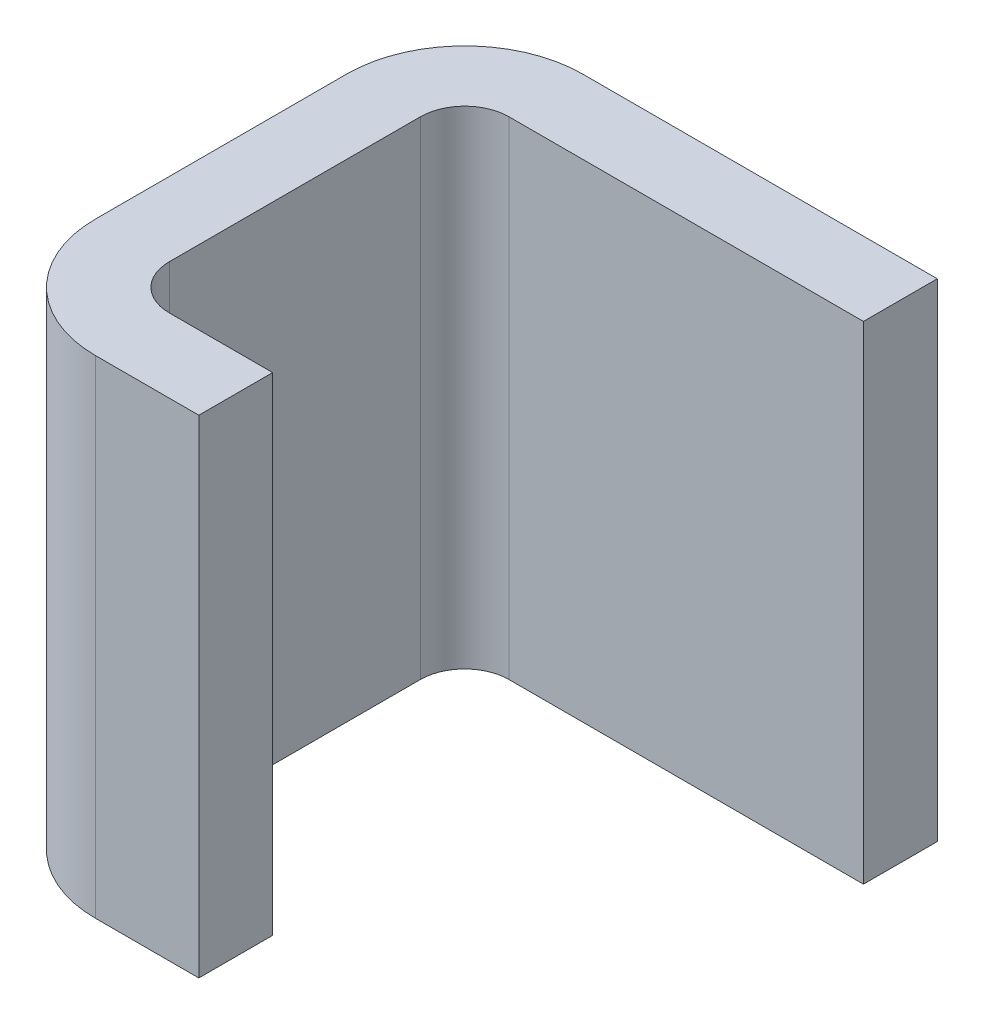
ISO-10303-21;
HEADER;
FILE_DESCRIPTION(('STEP AP214'),'2;1');
FILE_NAME('part.step','',(''),(''),'','','');
FILE_SCHEMA(('AUTOMOTIVE_DESIGN { 1 0 10303 214 1 1 1 1 }'));
ENDSEC;
DATA;
#1=APPLICATION_CONTEXT('core data for automotive mechanical design processes');
#2=APPLICATION_PROTOCOL_DEFINITION('international standard','automotive_design',2000,#1);
#3=PRODUCT_CONTEXT('',#1,'mechanical');
#4=PRODUCT('Part','Part','',(#3));
#5=PRODUCT_RELATED_PRODUCT_CATEGORY('part','',(#4));
#6=PRODUCT_DEFINITION_FORMATION('','',#4);
#7=PRODUCT_DEFINITION_CONTEXT('part definition',#1,'design');
#8=PRODUCT_DEFINITION('design','',#6,#7);
#9=PRODUCT_DEFINITION_SHAPE('','',#8);
#10=(LENGTH_UNIT() NAMED_UNIT(*) SI_UNIT(.MILLI.,.METRE.));
#11=(NAMED_UNIT(*) PLANE_ANGLE_UNIT() SI_UNIT($,.RADIAN.));
#12=(NAMED_UNIT(*) SI_UNIT($,.STERADIAN.) SOLID_ANGLE_UNIT());
#13=UNCERTAINTY_MEASURE_WITH_UNIT(LENGTH_MEASURE(1.E-05),#10,'distance_accuracy_value','');
#14=(GEOMETRIC_REPRESENTATION_CONTEXT(3) GLOBAL_UNCERTAINTY_ASSIGNED_CONTEXT((#13)) GLOBAL_UNIT_ASSIGNED_CONTEXT((#10,
#11,#12)) REPRESENTATION_CONTEXT('',''));
#15=CARTESIAN_POINT('',(0.,0.,0.));
#16=DIRECTION('',(0.,0.,1.));
#17=DIRECTION('',(1.,0.,0.));
#18=AXIS2_PLACEMENT_3D('',#15,#16,#17);
#19=CARTESIAN_POINT('',(0.800000000000002,-0.825,0.));
#20=DIRECTION('',(0.,0.,-1.));
#21=DIRECTION('',(-1.,0.,0.));
#22=AXIS2_PLACEMENT_3D('',#19,#20,#21);
#23=PLANE('',#22);
#24=DIRECTION('',(-1.,0.,0.));
#25=VECTOR('',#24,1.);
#26=CARTESIAN_POINT('',(0.800000000000002,-0.825,0.));
#27=LINE('',#26,#25);
#28=CARTESIAN_POINT('',(0.800000000000002,-0.825,0.));
#29=VERTEX_POINT('',#28);
#30=CARTESIAN_POINT('',(-0.399999999999998,-0.825,0.));
#31=VERTEX_POINT('',#30);
#32=EDGE_CURVE('E11',#29,#31,#27,.T.);
#33=ORIENTED_EDGE('',*,*,#32,.T.);
#34=DIRECTION('',(0.,1.,0.));
#35=VECTOR('',#34,1.);
#36=CARTESIAN_POINT('',(-0.399999999999998,-0.825,0.));
#37=LINE('',#36,#35);
#38=CARTESIAN_POINT('',(-0.399999999999998,0.825,0.));
#39=VERTEX_POINT('',#38);
#40=EDGE_CURVE('E24',#31,#39,#37,.T.);
#41=ORIENTED_EDGE('',*,*,#40,.T.);
#42=DIRECTION('',(-1.,0.,0.));
#43=VECTOR('',#42,1.);
#44=CARTESIAN_POINT('',(0.800000000000002,0.825,0.));
#45=LINE('',#44,#43);
#46=CARTESIAN_POINT('',(0.800000000000002,0.825,0.));
#47=VERTEX_POINT('',#46);
#48=EDGE_CURVE('E193',#47,#39,#45,.T.);
#49=ORIENTED_EDGE('',*,*,#48,.F.);
#50=DIRECTION('',(0.,1.,0.));
#51=VECTOR('',#50,1.);
#52=CARTESIAN_POINT('',(0.800000000000002,-0.825,0.));
#53=LINE('',#52,#51);
#54=EDGE_CURVE('E125',#29,#47,#53,.T.);
#55=ORIENTED_EDGE('',*,*,#54,.F.);
#56=EDGE_LOOP('',(#33,#41,#49,#55));
#57=FACE_BOUND('',#56,.T.);
#58=ADVANCED_FACE('F17',(#57),#23,.T.);
#59=CARTESIAN_POINT('',(-0.399999999999998,-0.825,0.4));
#60=DIRECTION('',(0.,1.,0.));
#61=DIRECTION('',(0.,0.,-1.));
#62=AXIS2_PLACEMENT_3D('',#59,#60,#61);
#63=CYLINDRICAL_SURFACE('',#62,0.4);
#64=CARTESIAN_POINT('',(-0.399999999999998,-0.825,0.4));
#65=DIRECTION('',(0.,1.,0.));
#66=DIRECTION('',(0.,0.,-1.));
#67=AXIS2_PLACEMENT_3D('',#64,#65,#66);
#68=CIRCLE('',#67,0.4);
#69=CARTESIAN_POINT('',(-0.8,-0.825,0.4));
#70=VERTEX_POINT('',#69);
#71=EDGE_CURVE('E190',#31,#70,#68,.T.);
#72=ORIENTED_EDGE('',*,*,#71,.T.);
#73=DIRECTION('',(0.,1.,0.));
#74=VECTOR('',#73,1.);
#75=CARTESIAN_POINT('',(-0.8,-0.825,0.4));
#76=LINE('',#75,#74);
#77=CARTESIAN_POINT('',(-0.8,0.825,0.4));
#78=VERTEX_POINT('',#77);
#79=EDGE_CURVE('E188',#70,#78,#76,.T.);
#80=ORIENTED_EDGE('',*,*,#79,.T.);
#81=CARTESIAN_POINT('',(-0.399999999999998,0.825,0.4));
#82=DIRECTION('',(0.,1.,0.));
#83=DIRECTION('',(0.,0.,-1.));
#84=AXIS2_PLACEMENT_3D('',#81,#82,#83);
#85=CIRCLE('',#84,0.4);
#86=EDGE_CURVE('E185',#39,#78,#85,.T.);
#87=ORIENTED_EDGE('',*,*,#86,.F.);
#88=ORIENTED_EDGE('',*,*,#40,.F.);
#89=EDGE_LOOP('',(#72,#80,#87,#88));
#90=FACE_BOUND('',#89,.T.);
#91=ADVANCED_FACE('F197',(#90),#63,.T.);
#92=CARTESIAN_POINT('',(-0.8,-0.825,0.4));
#93=DIRECTION('',(-1.,0.,0.));
#94=DIRECTION('',(0.,0.,1.));
#95=AXIS2_PLACEMENT_3D('',#92,#93,#94);
#96=PLANE('',#95);
#97=DIRECTION('',(0.,0.,1.));
#98=VECTOR('',#97,1.);
#99=CARTESIAN_POINT('',(-0.8,-0.825,0.4));
#100=LINE('',#99,#98);
#101=CARTESIAN_POINT('',(-0.8,-0.825,1.25));
#102=VERTEX_POINT('',#101);
#103=EDGE_CURVE('E183',#70,#102,#100,.T.);
#104=ORIENTED_EDGE('',*,*,#103,.T.);
#105=DIRECTION('',(0.,1.,0.));
#106=VECTOR('',#105,1.);
#107=CARTESIAN_POINT('',(-0.8,-0.825,1.25));
#108=LINE('',#107,#106);
#109=CARTESIAN_POINT('',(-0.8,0.825,1.25));
#110=VERTEX_POINT('',#109);
#111=EDGE_CURVE('E181',#102,#110,#108,.T.);
#112=ORIENTED_EDGE('',*,*,#111,.T.);
#113=DIRECTION('',(0.,0.,1.));
#114=VECTOR('',#113,1.);
#115=CARTESIAN_POINT('',(-0.8,0.825,0.4));
#116=LINE('',#115,#114);
#117=EDGE_CURVE('E178',#78,#110,#116,.T.);
#118=ORIENTED_EDGE('',*,*,#117,.F.);
#119=ORIENTED_EDGE('',*,*,#79,.F.);
#120=EDGE_LOOP('',(#104,#112,#118,#119));
#121=FACE_BOUND('',#120,.T.);
#122=ADVANCED_FACE('F201',(#121),#96,.T.);
#123=CARTESIAN_POINT('',(-0.4,-0.825,1.25));
#124=DIRECTION('',(0.,1.,0.));
#125=DIRECTION('',(-1.,0.,0.));
#126=AXIS2_PLACEMENT_3D('',#123,#124,#125);
#127=CYLINDRICAL_SURFACE('',#126,0.4);
#128=CARTESIAN_POINT('',(-0.4,-0.825,1.25));
#129=DIRECTION('',(0.,1.,0.));
#130=DIRECTION('',(-1.,0.,0.));
#131=AXIS2_PLACEMENT_3D('',#128,#129,#130);
#132=CIRCLE('',#131,0.4);
#133=CARTESIAN_POINT('',(-0.4,-0.825,1.65));
#134=VERTEX_POINT('',#133);
#135=EDGE_CURVE('E176',#102,#134,#132,.T.);
#136=ORIENTED_EDGE('',*,*,#135,.T.);
#137=DIRECTION('',(0.,1.,0.));
#138=VECTOR('',#137,1.);
#139=CARTESIAN_POINT('',(-0.4,-0.825,1.65));
#140=LINE('',#139,#138);
#141=CARTESIAN_POINT('',(-0.4,0.825,1.65));
#142=VERTEX_POINT('',#141);
#143=EDGE_CURVE('E174',#134,#142,#140,.T.);
#144=ORIENTED_EDGE('',*,*,#143,.T.);
#145=CARTESIAN_POINT('',(-0.4,0.825,1.25));
#146=DIRECTION('',(0.,1.,0.));
#147=DIRECTION('',(-1.,0.,0.));
#148=AXIS2_PLACEMENT_3D('',#145,#146,#147);
#149=CIRCLE('',#148,0.4);
#150=EDGE_CURVE('E171',#110,#142,#149,.T.);
#151=ORIENTED_EDGE('',*,*,#150,.F.);
#152=ORIENTED_EDGE('',*,*,#111,.F.);
#153=EDGE_LOOP('',(#136,#144,#151,#152));
#154=FACE_BOUND('',#153,.T.);
#155=ADVANCED_FACE('F209',(#154),#127,.T.);
#156=CARTESIAN_POINT('',(-0.4,-0.825,1.65));
#157=DIRECTION('',(0.,0.,1.));
#158=DIRECTION('',(1.,0.,0.));
#159=AXIS2_PLACEMENT_3D('',#156,#157,#158);
#160=PLANE('',#159);
#161=DIRECTION('',(1.,0.,0.));
#162=VECTOR('',#161,1.);
#163=CARTESIAN_POINT('',(-0.4,-0.825,1.65));
#164=LINE('',#163,#162);
#165=CARTESIAN_POINT('',(-0.0500000000000003,-0.825,1.65));
#166=VERTEX_POINT('',#165);
#167=EDGE_CURVE('E169',#134,#166,#164,.T.);
#168=ORIENTED_EDGE('',*,*,#167,.T.);
#169=DIRECTION('',(0.,1.,0.));
#170=VECTOR('',#169,1.);
#171=CARTESIAN_POINT('',(-0.0500000000000003,-0.825,1.65));
#172=LINE('',#171,#170);
#173=CARTESIAN_POINT('',(-0.0500000000000003,0.825,1.65));
#174=VERTEX_POINT('',#173);
#175=EDGE_CURVE('E167',#166,#174,#172,.T.);
#176=ORIENTED_EDGE('',*,*,#175,.T.);
#177=DIRECTION('',(1.,0.,0.));
#178=VECTOR('',#177,1.);
#179=CARTESIAN_POINT('',(-0.4,0.825,1.65));
#180=LINE('',#179,#178);
#181=EDGE_CURVE('E164',#142,#174,#180,.T.);
#182=ORIENTED_EDGE('',*,*,#181,.F.);
#183=ORIENTED_EDGE('',*,*,#143,.F.);
#184=EDGE_LOOP('',(#168,#176,#182,#183));
#185=FACE_BOUND('',#184,.T.);
#186=ADVANCED_FACE('F213',(#185),#160,.T.);
#187=CARTESIAN_POINT('',(-0.0500000000000003,-0.825,1.65));
#188=DIRECTION('',(1.,0.,0.));
#189=DIRECTION('',(0.,0.,-1.));
#190=AXIS2_PLACEMENT_3D('',#187,#188,#189);
#191=PLANE('',#190);
#192=DIRECTION('',(0.,0.,-1.));
#193=VECTOR('',#192,1.);
#194=CARTESIAN_POINT('',(-0.0500000000000003,-0.825,1.65));
#195=LINE('',#194,#193);
#196=CARTESIAN_POINT('',(-0.0500000000000003,-0.825,1.4));
#197=VERTEX_POINT('',#196);
#198=EDGE_CURVE('E162',#166,#197,#195,.T.);
#199=ORIENTED_EDGE('',*,*,#198,.T.);
#200=DIRECTION('',(0.,1.,0.));
#201=VECTOR('',#200,1.);
#202=CARTESIAN_POINT('',(-0.0500000000000003,-0.825,1.4));
#203=LINE('',#202,#201);
#204=CARTESIAN_POINT('',(-0.0500000000000003,0.825,1.4));
#205=VERTEX_POINT('',#204);
#206=EDGE_CURVE('E160',#197,#205,#203,.T.);
#207=ORIENTED_EDGE('',*,*,#206,.T.);
#208=DIRECTION('',(0.,0.,-1.));
#209=VECTOR('',#208,1.);
#210=CARTESIAN_POINT('',(-0.0500000000000003,0.825,1.65));
#211=LINE('',#210,#209);
#212=EDGE_CURVE('E157',#174,#205,#211,.T.);
#213=ORIENTED_EDGE('',*,*,#212,.F.);
#214=ORIENTED_EDGE('',*,*,#175,.F.);
#215=EDGE_LOOP('',(#199,#207,#213,#214));
#216=FACE_BOUND('',#215,.T.);
#217=ADVANCED_FACE('F218',(#216),#191,.T.);
#218=CARTESIAN_POINT('',(-0.0500000000000003,-0.825,1.4));
#219=DIRECTION('',(0.,0.,-1.));
#220=DIRECTION('',(-1.,0.,0.));
#221=AXIS2_PLACEMENT_3D('',#218,#219,#220);
#222=PLANE('',#221);
#223=DIRECTION('',(-1.,0.,0.));
#224=VECTOR('',#223,1.);
#225=CARTESIAN_POINT('',(-0.0500000000000003,-0.825,1.4));
#226=LINE('',#225,#224);
#227=CARTESIAN_POINT('',(-0.4,-0.825,1.4));
#228=VERTEX_POINT('',#227);
#229=EDGE_CURVE('E155',#197,#228,#226,.T.);
#230=ORIENTED_EDGE('',*,*,#229,.T.);
#231=DIRECTION('',(0.,1.,0.));
#232=VECTOR('',#231,1.);
#233=CARTESIAN_POINT('',(-0.4,-0.825,1.4));
#234=LINE('',#233,#232);
#235=CARTESIAN_POINT('',(-0.4,0.825,1.4));
#236=VERTEX_POINT('',#235);
#237=EDGE_CURVE('E153',#228,#236,#234,.T.);
#238=ORIENTED_EDGE('',*,*,#237,.T.);
#239=DIRECTION('',(-1.,0.,0.));
#240=VECTOR('',#239,1.);
#241=CARTESIAN_POINT('',(-0.0500000000000003,0.825,1.4));
#242=LINE('',#241,#240);
#243=EDGE_CURVE('E150',#205,#236,#242,.T.);
#244=ORIENTED_EDGE('',*,*,#243,.F.);
#245=ORIENTED_EDGE('',*,*,#206,.F.);
#246=EDGE_LOOP('',(#230,#238,#244,#245));
#247=FACE_BOUND('',#246,.T.);
#248=ADVANCED_FACE('F222',(#247),#222,.T.);
#249=CARTESIAN_POINT('',(-0.4,-0.825,1.25));
#250=DIRECTION('',(0.,-1.,0.));
#251=DIRECTION('',(0.,0.,1.));
#252=AXIS2_PLACEMENT_3D('',#249,#250,#251);
#253=CYLINDRICAL_SURFACE('',#252,0.15);
#254=CARTESIAN_POINT('',(-0.4,-0.825,1.25));
#255=DIRECTION('',(0.,-1.,0.));
#256=DIRECTION('',(0.,0.,1.));
#257=AXIS2_PLACEMENT_3D('',#254,#255,#256);
#258=CIRCLE('',#257,0.15);
#259=CARTESIAN_POINT('',(-0.55,-0.825,1.25));
#260=VERTEX_POINT('',#259);
#261=EDGE_CURVE('E147',#228,#260,#258,.T.);
#262=ORIENTED_EDGE('',*,*,#261,.T.);
#263=DIRECTION('',(0.,1.,0.));
#264=VECTOR('',#263,1.);
#265=CARTESIAN_POINT('',(-0.55,-0.825,1.25));
#266=LINE('',#265,#264);
#267=CARTESIAN_POINT('',(-0.55,0.825,1.25));
#268=VERTEX_POINT('',#267);
#269=EDGE_CURVE('E144',#260,#268,#266,.T.);
#270=ORIENTED_EDGE('',*,*,#269,.T.);
#271=CARTESIAN_POINT('',(-0.4,0.825,1.25));
#272=DIRECTION('',(0.,-1.,0.));
#273=DIRECTION('',(0.,0.,1.));
#274=AXIS2_PLACEMENT_3D('',#271,#272,#273);
#275=CIRCLE('',#274,0.15);
#276=EDGE_CURVE('E142',#236,#268,#275,.T.);
#277=ORIENTED_EDGE('',*,*,#276,.F.);
#278=ORIENTED_EDGE('',*,*,#237,.F.);
#279=EDGE_LOOP('',(#262,#270,#277,#278));
#280=FACE_BOUND('',#279,.T.);
#281=ADVANCED_FACE('F228',(#280),#253,.F.);
#282=CARTESIAN_POINT('',(-0.55,-0.825,1.25));
#283=DIRECTION('',(1.,0.,0.));
#284=DIRECTION('',(0.,0.,-1.));
#285=AXIS2_PLACEMENT_3D('',#282,#283,#284);
#286=PLANE('',#285);
#287=DIRECTION('',(0.,0.,-1.));
#288=VECTOR('',#287,1.);
#289=CARTESIAN_POINT('',(-0.55,-0.825,1.25));
#290=LINE('',#289,#288);
#291=CARTESIAN_POINT('',(-0.549999999999998,-0.825,0.4));
#292=VERTEX_POINT('',#291);
#293=EDGE_CURVE('E140',#260,#292,#290,.T.);
#294=ORIENTED_EDGE('',*,*,#293,.T.);
#295=DIRECTION('',(0.,1.,0.));
#296=VECTOR('',#295,1.);
#297=CARTESIAN_POINT('',(-0.55,-0.825,0.4));
#298=LINE('',#297,#296);
#299=CARTESIAN_POINT('',(-0.549999999999998,0.825,0.4));
#300=VERTEX_POINT('',#299);
#301=EDGE_CURVE('E138',#292,#300,#298,.T.);
#302=ORIENTED_EDGE('',*,*,#301,.T.);
#303=DIRECTION('',(0.,0.,-1.));
#304=VECTOR('',#303,1.);
#305=CARTESIAN_POINT('',(-0.55,0.825,1.25));
#306=LINE('',#305,#304);
#307=EDGE_CURVE('E136',#268,#300,#306,.T.);
#308=ORIENTED_EDGE('',*,*,#307,.F.);
#309=ORIENTED_EDGE('',*,*,#269,.F.);
#310=EDGE_LOOP('',(#294,#302,#308,#309));
#311=FACE_BOUND('',#310,.T.);
#312=ADVANCED_FACE('F235',(#311),#286,.T.);
#313=CARTESIAN_POINT('',(-0.399999999999998,-0.825,0.4));
#314=DIRECTION('',(0.,-1.,0.));
#315=DIRECTION('',(-1.,0.,0.));
#316=AXIS2_PLACEMENT_3D('',#313,#314,#315);
#317=CYLINDRICAL_SURFACE('',#316,0.15);
#318=CARTESIAN_POINT('',(-0.399999999999998,-0.825,0.4));
#319=DIRECTION('',(0.,-1.,0.));
#320=DIRECTION('',(-1.,0.,0.));
#321=AXIS2_PLACEMENT_3D('',#318,#319,#320);
#322=CIRCLE('',#321,0.15);
#323=CARTESIAN_POINT('',(-0.399999999999998,-0.825,0.25));
#324=VERTEX_POINT('',#323);
#325=EDGE_CURVE('E133',#292,#324,#322,.T.);
#326=ORIENTED_EDGE('',*,*,#325,.T.);
#327=DIRECTION('',(0.,1.,0.));
#328=VECTOR('',#327,1.);
#329=CARTESIAN_POINT('',(-0.399999999999998,-0.825,0.25));
#330=LINE('',#329,#328);
#331=CARTESIAN_POINT('',(-0.399999999999998,0.825,0.25));
#332=VERTEX_POINT('',#331);
#333=EDGE_CURVE('E131',#324,#332,#330,.T.);
#334=ORIENTED_EDGE('',*,*,#333,.T.);
#335=CARTESIAN_POINT('',(-0.399999999999998,0.825,0.4));
#336=DIRECTION('',(0.,-1.,0.));
#337=DIRECTION('',(-1.,0.,0.));
#338=AXIS2_PLACEMENT_3D('',#335,#336,#337);
#339=CIRCLE('',#338,0.15);
#340=EDGE_CURVE('E119',#300,#332,#339,.T.);
#341=ORIENTED_EDGE('',*,*,#340,.F.);
#342=ORIENTED_EDGE('',*,*,#301,.F.);
#343=EDGE_LOOP('',(#326,#334,#341,#342));
#344=FACE_BOUND('',#343,.T.);
#345=ADVANCED_FACE('F234',(#344),#317,.F.);
#346=CARTESIAN_POINT('',(-0.399999999999998,-0.825,0.25));
#347=DIRECTION('',(0.,0.,1.));
#348=DIRECTION('',(1.,0.,0.));
#349=AXIS2_PLACEMENT_3D('',#346,#347,#348);
#350=PLANE('',#349);
#351=DIRECTION('',(1.,0.,0.));
#352=VECTOR('',#351,1.);
#353=CARTESIAN_POINT('',(-0.399999999999998,-0.825,0.25));
#354=LINE('',#353,#352);
#355=CARTESIAN_POINT('',(0.800000000000002,-0.825,0.25));
#356=VERTEX_POINT('',#355);
#357=EDGE_CURVE('E107',#324,#356,#354,.T.);
#358=ORIENTED_EDGE('',*,*,#357,.T.);
#359=DIRECTION('',(0.,1.,0.));
#360=VECTOR('',#359,1.);
#361=CARTESIAN_POINT('',(0.800000000000001,-0.825,0.25));
#362=LINE('',#361,#360);
#363=CARTESIAN_POINT('',(0.800000000000002,0.825,0.25));
#364=VERTEX_POINT('',#363);
#365=EDGE_CURVE('E102',#356,#364,#362,.T.);
#366=ORIENTED_EDGE('',*,*,#365,.T.);
#367=DIRECTION('',(1.,0.,0.));
#368=VECTOR('',#367,1.);
#369=CARTESIAN_POINT('',(-0.399999999999998,0.825,0.25));
#370=LINE('',#369,#368);
#371=EDGE_CURVE('E105',#332,#364,#370,.T.);
#372=ORIENTED_EDGE('',*,*,#371,.F.);
#373=ORIENTED_EDGE('',*,*,#333,.F.);
#374=EDGE_LOOP('',(#358,#366,#372,#373));
#375=FACE_BOUND('',#374,.T.);
#376=ADVANCED_FACE('F104',(#375),#350,.T.);
#377=CARTESIAN_POINT('',(0.800000000000002,-0.825,0.25));
#378=DIRECTION('',(1.,0.,0.));
#379=DIRECTION('',(0.,0.,-1.));
#380=AXIS2_PLACEMENT_3D('',#377,#378,#379);
#381=PLANE('',#380);
#382=DIRECTION('',(0.,0.,-1.));
#383=VECTOR('',#382,1.);
#384=CARTESIAN_POINT('',(0.800000000000002,-0.825,0.25));
#385=LINE('',#384,#383);
#386=EDGE_CURVE('E121',#356,#29,#385,.T.);
#387=ORIENTED_EDGE('',*,*,#386,.T.);
#388=ORIENTED_EDGE('',*,*,#54,.T.);
#389=DIRECTION('',(0.,0.,-1.));
#390=VECTOR('',#389,1.);
#391=CARTESIAN_POINT('',(0.800000000000002,0.825,0.25));
#392=LINE('',#391,#390);
#393=EDGE_CURVE('E116',#364,#47,#392,.T.);
#394=ORIENTED_EDGE('',*,*,#393,.F.);
#395=ORIENTED_EDGE('',*,*,#365,.F.);
#396=EDGE_LOOP('',(#387,#388,#394,#395));
#397=FACE_BOUND('',#396,.T.);
#398=ADVANCED_FACE('F124',(#397),#381,.T.);
#399=CARTESIAN_POINT('',(0.,0.825,0.));
#400=DIRECTION('',(0.,1.,0.));
#401=DIRECTION('',(1.,0.,0.));
#402=AXIS2_PLACEMENT_3D('',#399,#400,#401);
#403=PLANE('',#402);
#404=ORIENTED_EDGE('',*,*,#48,.T.);
#405=ORIENTED_EDGE('',*,*,#86,.T.);
#406=ORIENTED_EDGE('',*,*,#117,.T.);
#407=ORIENTED_EDGE('',*,*,#150,.T.);
#408=ORIENTED_EDGE('',*,*,#181,.T.);
#409=ORIENTED_EDGE('',*,*,#212,.T.);
#410=ORIENTED_EDGE('',*,*,#243,.T.);
#411=ORIENTED_EDGE('',*,*,#276,.T.);
#412=ORIENTED_EDGE('',*,*,#307,.T.);
#413=ORIENTED_EDGE('',*,*,#340,.T.);
#414=ORIENTED_EDGE('',*,*,#371,.T.);
#415=ORIENTED_EDGE('',*,*,#393,.T.);
#416=EDGE_LOOP('',(#404,#405,#406,#407,#408,#409,#410,#411,#412,#413,#414,#415));
#417=FACE_BOUND('',#416,.T.);
#418=ADVANCED_FACE('F115',(#417),#403,.T.);
#419=CARTESIAN_POINT('',(0.,-0.825,0.));
#420=DIRECTION('',(0.,1.,0.));
#421=DIRECTION('',(1.,0.,0.));
#422=AXIS2_PLACEMENT_3D('',#419,#420,#421);
#423=PLANE('',#422);
#424=ORIENTED_EDGE('',*,*,#386,.F.);
#425=ORIENTED_EDGE('',*,*,#357,.F.);
#426=ORIENTED_EDGE('',*,*,#325,.F.);
#427=ORIENTED_EDGE('',*,*,#293,.F.);
#428=ORIENTED_EDGE('',*,*,#261,.F.);
#429=ORIENTED_EDGE('',*,*,#229,.F.);
#430=ORIENTED_EDGE('',*,*,#198,.F.);
#431=ORIENTED_EDGE('',*,*,#167,.F.);
#432=ORIENTED_EDGE('',*,*,#135,.F.);
#433=ORIENTED_EDGE('',*,*,#103,.F.);
#434=ORIENTED_EDGE('',*,*,#71,.F.);
#435=ORIENTED_EDGE('',*,*,#32,.F.);
#436=EDGE_LOOP('',(#424,#425,#426,#427,#428,#429,#430,#431,#432,#433,#434,#435));
#437=FACE_BOUND('',#436,.T.);
#438=ADVANCED_FACE('F204',(#437),#423,.F.);
#439=CLOSED_SHELL('',(#58,#91,#122,#155,#186,#217,#248,#281,#312,#345,#376,#398,#418,#438));
#440=MANIFOLD_SOLID_BREP('B1',#439);
#441=ADVANCED_BREP_SHAPE_REPRESENTATION('',(#18,#440),#14);
#442=SHAPE_DEFINITION_REPRESENTATION(#9,#441);
ENDSEC;
END-ISO-10303-21;
